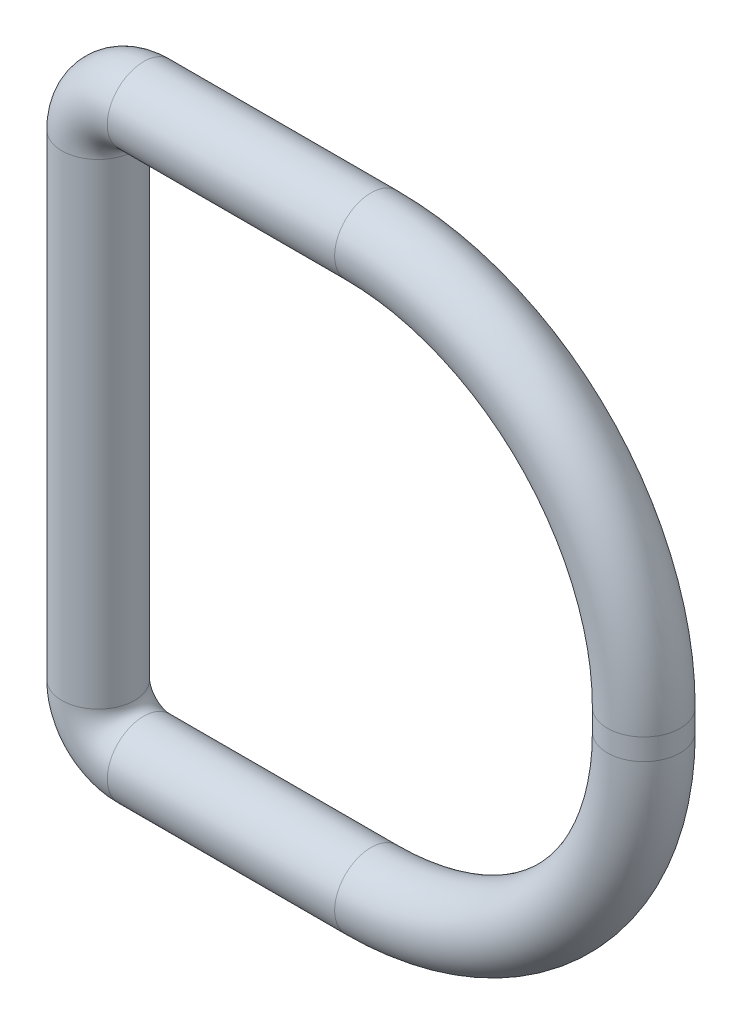
ISO-10303-21;
HEADER;
FILE_DESCRIPTION(('STEP AP214'),'2;1');
FILE_NAME('part.step','',(''),(''),'','','');
FILE_SCHEMA(('AUTOMOTIVE_DESIGN { 1 0 10303 214 1 1 1 1 }'));
ENDSEC;
DATA;
#1=APPLICATION_CONTEXT('core data for automotive mechanical design processes');
#2=APPLICATION_PROTOCOL_DEFINITION('international standard','automotive_design',2000,#1);
#3=PRODUCT_CONTEXT('',#1,'mechanical');
#4=PRODUCT('Part','Part','',(#3));
#5=PRODUCT_RELATED_PRODUCT_CATEGORY('part','',(#4));
#6=PRODUCT_DEFINITION_FORMATION('','',#4);
#7=PRODUCT_DEFINITION_CONTEXT('part definition',#1,'design');
#8=PRODUCT_DEFINITION('design','',#6,#7);
#9=PRODUCT_DEFINITION_SHAPE('','',#8);
#10=(LENGTH_UNIT() NAMED_UNIT(*) SI_UNIT(.MILLI.,.METRE.));
#11=(NAMED_UNIT(*) PLANE_ANGLE_UNIT() SI_UNIT($,.RADIAN.));
#12=(NAMED_UNIT(*) SI_UNIT($,.STERADIAN.) SOLID_ANGLE_UNIT());
#13=UNCERTAINTY_MEASURE_WITH_UNIT(LENGTH_MEASURE(1.E-05),#10,'distance_accuracy_value','');
#14=(GEOMETRIC_REPRESENTATION_CONTEXT(3) GLOBAL_UNCERTAINTY_ASSIGNED_CONTEXT((#13)) GLOBAL_UNIT_ASSIGNED_CONTEXT((#10,
#11,#12)) REPRESENTATION_CONTEXT('',''));
#15=CARTESIAN_POINT('',(0.,0.,0.));
#16=DIRECTION('',(0.,0.,1.));
#17=DIRECTION('',(1.,0.,0.));
#18=AXIS2_PLACEMENT_3D('',#15,#16,#17);
#19=CARTESIAN_POINT('',(5.,-0.5,0.));
#20=DIRECTION('',(0.,0.,-1.));
#21=DIRECTION('',(-1.,0.,0.));
#22=AXIS2_PLACEMENT_3D('',#19,#20,#21);
#23=TOROIDAL_SURFACE('',#22,2.5,2.);
#24=CARTESIAN_POINT('',(5.00000000000002,-3.,0.));
#25=DIRECTION('',(-1.,0.,0.));
#26=DIRECTION('',(0.,0.,1.));
#27=AXIS2_PLACEMENT_3D('',#24,#25,#26);
#28=CIRCLE('',#27,2.);
#29=CARTESIAN_POINT('',(5.00000000000003,-5.,0.));
#30=VERTEX_POINT('',#29);
#31=EDGE_CURVE('E36',#30,#30,#28,.T.);
#32=CARTESIAN_POINT('',(2.5,-0.5,0.));
#33=DIRECTION('',(0.,1.,0.));
#34=DIRECTION('',(0.,0.,1.));
#35=AXIS2_PLACEMENT_3D('',#32,#33,#34);
#36=CIRCLE('',#35,2.);
#37=CARTESIAN_POINT('',(0.5,-0.5,0.));
#38=VERTEX_POINT('',#37);
#39=EDGE_CURVE('E10',#38,#38,#36,.T.);
#40=CARTESIAN_POINT('',(5.,-0.5,0.));
#41=DIRECTION('',(0.,0.,-1.));
#42=DIRECTION('',(-1.,0.,0.));
#43=AXIS2_PLACEMENT_3D('',#40,#41,#42);
#44=CIRCLE('',#43,4.5);
#45=EDGE_CURVE('',#30,#38,#44,.T.);
#46=ORIENTED_EDGE('',*,*,#31,.T.);
#47=ORIENTED_EDGE('',*,*,#39,.F.);
#48=ORIENTED_EDGE('',*,*,#45,.T.);
#49=ORIENTED_EDGE('',*,*,#45,.F.);
#50=EDGE_LOOP('',(#46,#48,#47,#49));
#51=FACE_BOUND('',#50,.T.);
#52=ADVANCED_FACE('F30',(#51),#23,.T.);
#53=CARTESIAN_POINT('',(17.4999999999999,-3.,0.));
#54=DIRECTION('',(-1.,0.,0.));
#55=DIRECTION('',(0.,-1.,0.));
#56=AXIS2_PLACEMENT_3D('',#53,#54,#55);
#57=CYLINDRICAL_SURFACE('',#56,2.);
#58=CARTESIAN_POINT('',(17.4999999999999,-3.,0.));
#59=DIRECTION('',(-1.,0.,0.));
#60=DIRECTION('',(0.,0.,1.));
#61=AXIS2_PLACEMENT_3D('',#58,#59,#60);
#62=CIRCLE('',#61,2.);
#63=CARTESIAN_POINT('',(17.4999999999998,-5.,0.));
#64=VERTEX_POINT('',#63);
#65=EDGE_CURVE('E40',#64,#64,#62,.T.);
#66=CARTESIAN_POINT('',(17.4999999999998,-5.,0.));
#67=CARTESIAN_POINT('',(17.3697916666665,-5.,0.));
#68=CARTESIAN_POINT('',(17.2395833333332,-5.,0.));
#69=CARTESIAN_POINT('',(16.9791666666665,-5.,0.));
#70=CARTESIAN_POINT('',(16.8489583333332,-5.,0.));
#71=CARTESIAN_POINT('',(16.5885416666665,-5.,0.));
#72=CARTESIAN_POINT('',(16.4583333333332,-5.,0.));
#73=CARTESIAN_POINT('',(16.1979166666665,-5.,0.));
#74=CARTESIAN_POINT('',(16.0677083333332,-5.,0.));
#75=CARTESIAN_POINT('',(15.8072916666665,-5.,0.));
#76=CARTESIAN_POINT('',(15.6770833333332,-5.,0.));
#77=CARTESIAN_POINT('',(15.4166666666665,-5.,0.));
#78=CARTESIAN_POINT('',(15.2864583333332,-5.,0.));
#79=CARTESIAN_POINT('',(15.0260416666665,-5.,0.));
#80=CARTESIAN_POINT('',(14.8958333333332,-5.,0.));
#81=CARTESIAN_POINT('',(14.6354166666665,-5.,0.));
#82=CARTESIAN_POINT('',(14.5052083333332,-5.,0.));
#83=CARTESIAN_POINT('',(14.2447916666665,-5.,0.));
#84=CARTESIAN_POINT('',(14.1145833333332,-5.,0.));
#85=CARTESIAN_POINT('',(13.8541666666665,-5.,0.));
#86=CARTESIAN_POINT('',(13.7239583333332,-5.,0.));
#87=CARTESIAN_POINT('',(13.4635416666665,-5.,0.));
#88=CARTESIAN_POINT('',(13.3333333333332,-5.,0.));
#89=CARTESIAN_POINT('',(13.0729166666665,-5.,0.));
#90=CARTESIAN_POINT('',(12.9427083333332,-5.,0.));
#91=CARTESIAN_POINT('',(12.6822916666665,-5.,0.));
#92=CARTESIAN_POINT('',(12.5520833333332,-5.,0.));
#93=CARTESIAN_POINT('',(12.2916666666665,-5.,0.));
#94=CARTESIAN_POINT('',(12.1614583333332,-5.,0.));
#95=CARTESIAN_POINT('',(11.9010416666665,-5.,0.));
#96=CARTESIAN_POINT('',(11.7708333333332,-5.,0.));
#97=CARTESIAN_POINT('',(11.5104166666665,-5.,0.));
#98=CARTESIAN_POINT('',(11.3802083333332,-5.,0.));
#99=CARTESIAN_POINT('',(11.1197916666665,-5.,0.));
#100=CARTESIAN_POINT('',(10.9895833333332,-5.,0.));
#101=CARTESIAN_POINT('',(10.7291666666665,-5.,0.));
#102=CARTESIAN_POINT('',(10.5989583333332,-5.,0.));
#103=CARTESIAN_POINT('',(10.3385416666666,-5.,0.));
#104=CARTESIAN_POINT('',(10.2083333333332,-5.,0.));
#105=CARTESIAN_POINT('',(9.94791666666656,-5.,0.));
#106=CARTESIAN_POINT('',(9.81770833333322,-5.,0.));
#107=CARTESIAN_POINT('',(9.55729166666656,-5.,0.));
#108=CARTESIAN_POINT('',(9.42708333333323,-5.,0.));
#109=CARTESIAN_POINT('',(9.16666666666656,-5.,0.));
#110=CARTESIAN_POINT('',(9.03645833333323,-5.,0.));
#111=CARTESIAN_POINT('',(8.77604166666657,-5.,0.));
#112=CARTESIAN_POINT('',(8.64583333333324,-5.,0.));
#113=CARTESIAN_POINT('',(8.38541666666657,-5.,0.));
#114=CARTESIAN_POINT('',(8.25520833333324,-5.,0.));
#115=CARTESIAN_POINT('',(7.99479166666658,-5.,0.));
#116=CARTESIAN_POINT('',(7.86458333333324,-5.,0.));
#117=CARTESIAN_POINT('',(7.60416666666658,-5.,0.));
#118=CARTESIAN_POINT('',(7.47395833333325,-5.,0.));
#119=CARTESIAN_POINT('',(7.21354166666658,-5.,0.));
#120=CARTESIAN_POINT('',(7.08333333333325,-5.,0.));
#121=CARTESIAN_POINT('',(6.82291666666659,-5.,0.));
#122=CARTESIAN_POINT('',(6.69270833333325,-5.,0.));
#123=CARTESIAN_POINT('',(6.43229166666659,-5.,0.));
#124=CARTESIAN_POINT('',(6.30208333333326,-5.,0.));
#125=CARTESIAN_POINT('',(6.04166666666659,-5.,0.));
#126=CARTESIAN_POINT('',(5.91145833333326,-5.,0.));
#127=CARTESIAN_POINT('',(5.6510416666666,-5.,0.));
#128=CARTESIAN_POINT('',(5.52083333333327,-5.,0.));
#129=CARTESIAN_POINT('',(5.2604166666666,-5.,0.));
#130=CARTESIAN_POINT('',(5.13020833333327,-5.,0.));
#131=CARTESIAN_POINT('',(4.99999999999994,-5.,0.));
#132=B_SPLINE_CURVE_WITH_KNOTS('',3,(#66,#67,#68,#69,#70,#71,#72,#73,#74,#75,#76,#77,#78,#79,
#80,#81,#82,#83,#84,#85,#86,#87,#88,#89,#90,#91,#92,#93,#94,#95,#96,#97,#98,#99,#100,#101,#102,
#103,#104,#105,#106,#107,#108,#109,#110,#111,#112,#113,#114,#115,#116,#117,#118,#119,#120,#121,
#122,#123,#124,#125,#126,#127,#128,#129,#130,#131),.UNSPECIFIED.,.F.,.F.,(4,2,2,2,2,2,2,2,2,2,2,
2,2,2,2,2,2,2,2,2,2,2,2,2,2,2,2,2,2,2,2,2,4),(0.,0.390624999999999,0.781249999999994,
1.17187499999999,1.56249999999999,1.95312499999998,2.34374999999998,2.73437499999997,
3.12499999999997,3.51562499999997,3.90624999999996,4.29687499999996,4.68749999999996,
5.07812499999995,5.46874999999995,5.85937499999994,6.24999999999994,6.64062499999994,
7.03124999999993,7.42187499999993,7.81249999999993,8.20312499999992,8.59374999999992,
8.98437499999991,9.37499999999991,9.76562499999991,10.1562499999999,10.5468749999999,
10.9374999999999,11.3281249999999,11.7187499999999,12.1093749999999,12.4999999999999),.UNSPECIFIED.);
#133=EDGE_CURVE('BSEAM74',#64,#30,#132,.T.);
#134=ORIENTED_EDGE('',*,*,#65,.T.);
#135=ORIENTED_EDGE('',*,*,#31,.F.);
#136=ORIENTED_EDGE('',*,*,#133,.T.);
#137=ORIENTED_EDGE('',*,*,#133,.F.);
#138=EDGE_LOOP('',(#134,#136,#135,#137));
#139=FACE_BOUND('',#138,.T.);
#140=ADVANCED_FACE('F74',(#139),#57,.T.);
#141=CARTESIAN_POINT('',(17.5,12.,0.));
#142=DIRECTION('',(0.,0.,-1.));
#143=DIRECTION('',(-1.,0.,0.));
#144=AXIS2_PLACEMENT_3D('',#141,#142,#143);
#145=TOROIDAL_SURFACE('',#144,15.,2.);
#146=CARTESIAN_POINT('',(32.5,12.0000000000001,0.));
#147=DIRECTION('',(0.,-1.,0.));
#148=DIRECTION('',(0.,0.,1.));
#149=AXIS2_PLACEMENT_3D('',#146,#147,#148);
#150=CIRCLE('',#149,2.);
#151=CARTESIAN_POINT('',(34.5,12.0000000000001,0.));
#152=VERTEX_POINT('',#151);
#153=EDGE_CURVE('E44',#152,#152,#150,.T.);
#154=CARTESIAN_POINT('',(17.5,12.,0.));
#155=DIRECTION('',(0.,0.,-1.));
#156=DIRECTION('',(-1.,0.,0.));
#157=AXIS2_PLACEMENT_3D('',#154,#155,#156);
#158=CIRCLE('',#157,17.);
#159=EDGE_CURVE('',#152,#64,#158,.T.);
#160=ORIENTED_EDGE('',*,*,#153,.T.);
#161=ORIENTED_EDGE('',*,*,#65,.F.);
#162=ORIENTED_EDGE('',*,*,#159,.T.);
#163=ORIENTED_EDGE('',*,*,#159,.F.);
#164=EDGE_LOOP('',(#160,#162,#161,#163));
#165=FACE_BOUND('',#164,.T.);
#166=ADVANCED_FACE('F78',(#165),#145,.T.);
#167=CARTESIAN_POINT('',(32.5,13.1729216599567,0.));
#168=DIRECTION('',(0.,-1.,0.));
#169=DIRECTION('',(0.,0.,-1.));
#170=AXIS2_PLACEMENT_3D('',#167,#168,#169);
#171=CYLINDRICAL_SURFACE('',#170,2.);
#172=CARTESIAN_POINT('',(32.5,13.1729216599567,0.));
#173=DIRECTION('',(0.,-1.,0.));
#174=DIRECTION('',(0.,0.,1.));
#175=AXIS2_PLACEMENT_3D('',#172,#173,#174);
#176=CIRCLE('',#175,2.);
#177=CARTESIAN_POINT('',(34.5,13.1729216599567,0.));
#178=VERTEX_POINT('',#177);
#179=EDGE_CURVE('E49',#178,#178,#176,.T.);
#180=ORIENTED_EDGE('',*,*,#179,.T.);
#181=EDGE_LOOP('',(#180));
#182=FACE_BOUND('',#181,.T.);
#183=ORIENTED_EDGE('',*,*,#153,.F.);
#184=EDGE_LOOP('',(#183));
#185=FACE_BOUND('',#184,.T.);
#186=ADVANCED_FACE('F84',(#182,#185),#171,.T.);
#187=CARTESIAN_POINT('',(17.5,13.1729216599568,0.));
#188=DIRECTION('',(0.,0.,-1.));
#189=DIRECTION('',(-1.,0.,0.));
#190=AXIS2_PLACEMENT_3D('',#187,#188,#189);
#191=TOROIDAL_SURFACE('',#190,15.,2.);
#192=CARTESIAN_POINT('',(17.4999999999999,28.1729216599568,0.));
#193=DIRECTION('',(1.,0.,0.));
#194=DIRECTION('',(0.,0.,1.));
#195=AXIS2_PLACEMENT_3D('',#192,#193,#194);
#196=CIRCLE('',#195,2.);
#197=CARTESIAN_POINT('',(17.4999999999999,30.1729216599568,0.));
#198=VERTEX_POINT('',#197);
#199=EDGE_CURVE('E52',#198,#198,#196,.T.);
#200=CARTESIAN_POINT('',(17.5,13.1729216599568,0.));
#201=DIRECTION('',(0.,0.,-1.));
#202=DIRECTION('',(-1.,0.,0.));
#203=AXIS2_PLACEMENT_3D('',#200,#201,#202);
#204=CIRCLE('',#203,17.);
#205=EDGE_CURVE('',#198,#178,#204,.T.);
#206=ORIENTED_EDGE('',*,*,#199,.T.);
#207=ORIENTED_EDGE('',*,*,#179,.F.);
#208=ORIENTED_EDGE('',*,*,#205,.T.);
#209=ORIENTED_EDGE('',*,*,#205,.F.);
#210=EDGE_LOOP('',(#206,#208,#207,#209));
#211=FACE_BOUND('',#210,.T.);
#212=ADVANCED_FACE('F91',(#211),#191,.T.);
#213=CARTESIAN_POINT('',(5.00000000000002,28.1729216599568,0.));
#214=DIRECTION('',(1.,0.,0.));
#215=DIRECTION('',(0.,0.,-1.));
#216=AXIS2_PLACEMENT_3D('',#213,#214,#215);
#217=CYLINDRICAL_SURFACE('',#216,2.);
#218=CARTESIAN_POINT('',(5.00000000000002,28.1729216599568,0.));
#219=DIRECTION('',(1.,0.,0.));
#220=DIRECTION('',(0.,0.,1.));
#221=AXIS2_PLACEMENT_3D('',#218,#219,#220);
#222=CIRCLE('',#221,2.);
#223=CARTESIAN_POINT('',(5.00000000000003,30.1729216599568,0.));
#224=VERTEX_POINT('',#223);
#225=EDGE_CURVE('E55',#224,#224,#222,.T.);
#226=ORIENTED_EDGE('',*,*,#225,.T.);
#227=EDGE_LOOP('',(#226));
#228=FACE_BOUND('',#227,.T.);
#229=ORIENTED_EDGE('',*,*,#199,.F.);
#230=EDGE_LOOP('',(#229));
#231=FACE_BOUND('',#230,.T.);
#232=ADVANCED_FACE('F71',(#228,#231),#217,.T.);
#233=CARTESIAN_POINT('',(5.,25.6729216599568,0.));
#234=DIRECTION('',(0.,0.,-1.));
#235=DIRECTION('',(-1.,0.,0.));
#236=AXIS2_PLACEMENT_3D('',#233,#234,#235);
#237=TOROIDAL_SURFACE('',#236,2.5,2.);
#238=CARTESIAN_POINT('',(2.5,25.6729216599568,0.));
#239=DIRECTION('',(0.,1.,0.));
#240=DIRECTION('',(0.,0.,1.));
#241=AXIS2_PLACEMENT_3D('',#238,#239,#240);
#242=CIRCLE('',#241,2.);
#243=CARTESIAN_POINT('',(0.5,25.6729216599567,0.));
#244=VERTEX_POINT('',#243);
#245=EDGE_CURVE('E58',#244,#244,#242,.T.);
#246=CARTESIAN_POINT('',(5.,25.6729216599568,0.));
#247=DIRECTION('',(0.,0.,-1.));
#248=DIRECTION('',(-1.,0.,0.));
#249=AXIS2_PLACEMENT_3D('',#246,#247,#248);
#250=CIRCLE('',#249,4.5);
#251=EDGE_CURVE('',#244,#224,#250,.T.);
#252=ORIENTED_EDGE('',*,*,#245,.T.);
#253=ORIENTED_EDGE('',*,*,#225,.F.);
#254=ORIENTED_EDGE('',*,*,#251,.T.);
#255=ORIENTED_EDGE('',*,*,#251,.F.);
#256=EDGE_LOOP('',(#252,#254,#253,#255));
#257=FACE_BOUND('',#256,.T.);
#258=ADVANCED_FACE('F62',(#257),#237,.T.);
#259=CARTESIAN_POINT('',(2.5,25.6729216599568,0.));
#260=DIRECTION('',(0.,-1.,0.));
#261=DIRECTION('',(0.,0.,-1.));
#262=AXIS2_PLACEMENT_3D('',#259,#260,#261);
#263=CYLINDRICAL_SURFACE('',#262,2.);
#264=ORIENTED_EDGE('',*,*,#245,.F.);
#265=EDGE_LOOP('',(#264));
#266=FACE_BOUND('',#265,.T.);
#267=ORIENTED_EDGE('',*,*,#39,.T.);
#268=EDGE_LOOP('',(#267));
#269=FACE_BOUND('',#268,.T.);
#270=ADVANCED_FACE('F65',(#266,#269),#263,.T.);
#271=CLOSED_SHELL('',(#52,#140,#166,#186,#212,#232,#258,#270));
#272=MANIFOLD_SOLID_BREP('B2',#271);
#273=ADVANCED_BREP_SHAPE_REPRESENTATION('',(#18,#272),#14);
#274=SHAPE_DEFINITION_REPRESENTATION(#9,#273);
ENDSEC;
END-ISO-10303-21;
